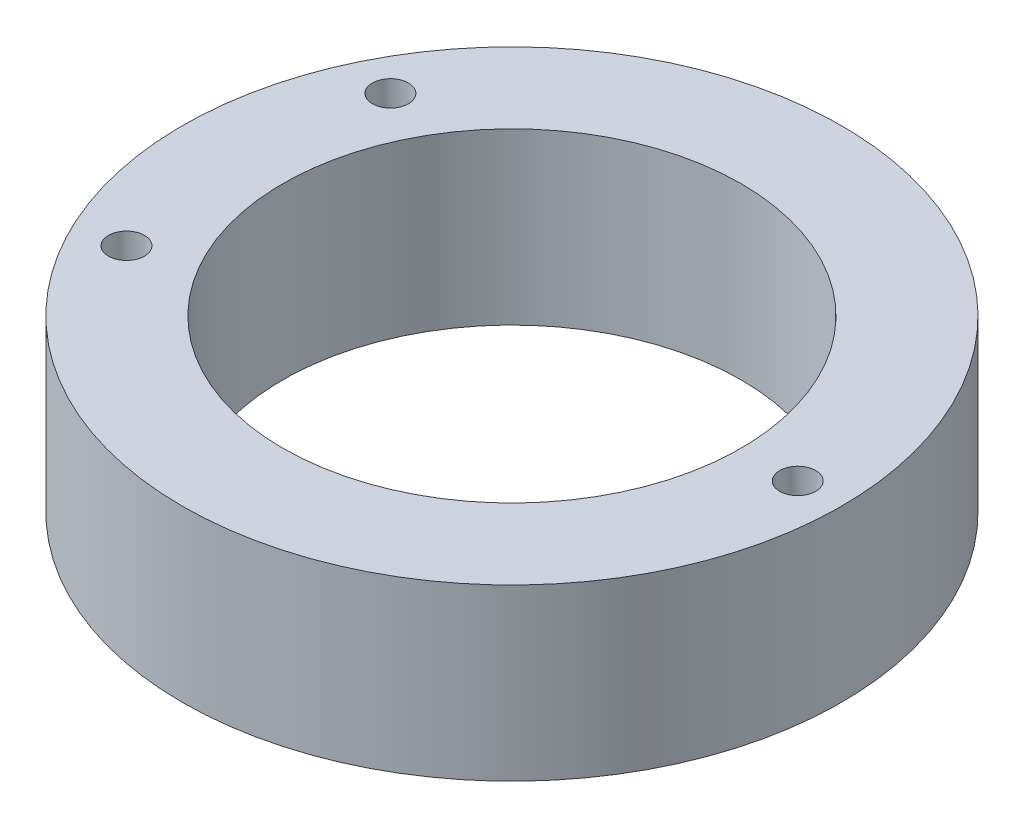
ISO-10303-21;
HEADER;
FILE_DESCRIPTION(('STEP AP214'),'2;1');
FILE_NAME('part.step','',(''),(''),'','','');
FILE_SCHEMA(('AUTOMOTIVE_DESIGN { 1 0 10303 214 1 1 1 1 }'));
ENDSEC;
DATA;
#1=APPLICATION_CONTEXT('core data for automotive mechanical design processes');
#2=APPLICATION_PROTOCOL_DEFINITION('international standard','automotive_design',2000,#1);
#3=PRODUCT_CONTEXT('',#1,'mechanical');
#4=PRODUCT('Part','Part','',(#3));
#5=PRODUCT_RELATED_PRODUCT_CATEGORY('part','',(#4));
#6=PRODUCT_DEFINITION_FORMATION('','',#4);
#7=PRODUCT_DEFINITION_CONTEXT('part definition',#1,'design');
#8=PRODUCT_DEFINITION('design','',#6,#7);
#9=PRODUCT_DEFINITION_SHAPE('','',#8);
#10=(LENGTH_UNIT() NAMED_UNIT(*) SI_UNIT(.MILLI.,.METRE.));
#11=(NAMED_UNIT(*) PLANE_ANGLE_UNIT() SI_UNIT($,.RADIAN.));
#12=(NAMED_UNIT(*) SI_UNIT($,.STERADIAN.) SOLID_ANGLE_UNIT());
#13=UNCERTAINTY_MEASURE_WITH_UNIT(LENGTH_MEASURE(1.E-05),#10,'distance_accuracy_value','');
#14=(GEOMETRIC_REPRESENTATION_CONTEXT(3) GLOBAL_UNCERTAINTY_ASSIGNED_CONTEXT((#13)) GLOBAL_UNIT_ASSIGNED_CONTEXT((#10,
#11,#12)) REPRESENTATION_CONTEXT('',''));
#15=CARTESIAN_POINT('',(0.,0.,0.));
#16=DIRECTION('',(0.,0.,1.));
#17=DIRECTION('',(1.,0.,0.));
#18=AXIS2_PLACEMENT_3D('',#15,#16,#17);
#19=CARTESIAN_POINT('',(0.,16.5,0.));
#20=DIRECTION('',(0.,1.,0.));
#21=DIRECTION('',(0.,0.,1.));
#22=AXIS2_PLACEMENT_3D('',#19,#20,#21);
#23=PLANE('',#22);
#24=CARTESIAN_POINT('',(-24.6145506206957,16.5,-12.8135240172721));
#25=DIRECTION('',(0.,1.,0.));
#26=DIRECTION('',(0.,0.,1.));
#27=AXIS2_PLACEMENT_3D('',#24,#25,#26);
#28=CIRCLE('',#27,1.75);
#29=CARTESIAN_POINT('',(-24.6145506206957,16.5,-11.0635240172721));
#30=VERTEX_POINT('',#29);
#31=EDGE_CURVE('E57',#30,#30,#28,.T.);
#32=ORIENTED_EDGE('',*,*,#31,.F.);
#33=EDGE_LOOP('',(#32));
#34=FACE_BOUND('',#33,.T.);
#35=CARTESIAN_POINT('',(0.,16.5,0.));
#36=DIRECTION('',(0.,1.,0.));
#37=DIRECTION('',(0.,0.,1.));
#38=AXIS2_PLACEMENT_3D('',#35,#36,#37);
#39=CIRCLE('',#38,22.25);
#40=CARTESIAN_POINT('',(0.,16.5,22.25));
#41=VERTEX_POINT('',#40);
#42=EDGE_CURVE('E46',#41,#41,#39,.T.);
#43=ORIENTED_EDGE('',*,*,#42,.F.);
#44=EDGE_LOOP('',(#43));
#45=FACE_BOUND('',#44,.T.);
#46=CARTESIAN_POINT('',(0.,16.5,0.));
#47=DIRECTION('',(0.,1.,0.));
#48=DIRECTION('',(0.,0.,1.));
#49=AXIS2_PLACEMENT_3D('',#46,#47,#48);
#50=CIRCLE('',#49,32.);
#51=CARTESIAN_POINT('',(0.,16.5,32.));
#52=VERTEX_POINT('',#51);
#53=EDGE_CURVE('E10',#52,#52,#50,.T.);
#54=ORIENTED_EDGE('',*,*,#53,.T.);
#55=EDGE_LOOP('',(#54));
#56=FACE_BOUND('',#55,.T.);
#57=CARTESIAN_POINT('',(27.75,16.5,0.));
#58=DIRECTION('',(0.,1.,0.));
#59=DIRECTION('',(0.,0.,1.));
#60=AXIS2_PLACEMENT_3D('',#57,#58,#59);
#61=CIRCLE('',#60,1.75);
#62=CARTESIAN_POINT('',(27.75,16.5,1.75));
#63=VERTEX_POINT('',#62);
#64=EDGE_CURVE('E51',#63,#63,#61,.T.);
#65=ORIENTED_EDGE('',*,*,#64,.F.);
#66=EDGE_LOOP('',(#65));
#67=FACE_BOUND('',#66,.T.);
#68=CARTESIAN_POINT('',(-24.6145506206957,16.5,12.8135240172721));
#69=DIRECTION('',(0.,1.,0.));
#70=DIRECTION('',(0.,0.,1.));
#71=AXIS2_PLACEMENT_3D('',#68,#69,#70);
#72=CIRCLE('',#71,1.75);
#73=CARTESIAN_POINT('',(-24.6145506206957,16.5,14.5635240172721));
#74=VERTEX_POINT('',#73);
#75=EDGE_CURVE('E63',#74,#74,#72,.T.);
#76=ORIENTED_EDGE('',*,*,#75,.F.);
#77=EDGE_LOOP('',(#76));
#78=FACE_BOUND('',#77,.T.);
#79=ADVANCED_FACE('F35',(#34,#45,#56,#67,#78),#23,.T.);
#80=CARTESIAN_POINT('',(0.,0.,0.));
#81=DIRECTION('',(0.,1.,0.));
#82=DIRECTION('',(0.,0.,1.));
#83=AXIS2_PLACEMENT_3D('',#80,#81,#82);
#84=PLANE('',#83);
#85=CARTESIAN_POINT('',(0.,0.,0.));
#86=DIRECTION('',(0.,1.,0.));
#87=DIRECTION('',(0.,0.,1.));
#88=AXIS2_PLACEMENT_3D('',#85,#86,#87);
#89=CIRCLE('',#88,32.);
#90=CARTESIAN_POINT('',(0.,0.,32.));
#91=VERTEX_POINT('',#90);
#92=EDGE_CURVE('E39',#91,#91,#89,.T.);
#93=ORIENTED_EDGE('',*,*,#92,.F.);
#94=EDGE_LOOP('',(#93));
#95=FACE_BOUND('',#94,.T.);
#96=CARTESIAN_POINT('',(0.,0.,0.));
#97=DIRECTION('',(0.,1.,0.));
#98=DIRECTION('',(0.,0.,1.));
#99=AXIS2_PLACEMENT_3D('',#96,#97,#98);
#100=CIRCLE('',#99,22.25);
#101=CARTESIAN_POINT('',(0.,0.,22.25));
#102=VERTEX_POINT('',#101);
#103=EDGE_CURVE('E48',#102,#102,#100,.T.);
#104=ORIENTED_EDGE('',*,*,#103,.T.);
#105=EDGE_LOOP('',(#104));
#106=FACE_BOUND('',#105,.T.);
#107=CARTESIAN_POINT('',(27.75,0.,0.));
#108=DIRECTION('',(0.,1.,0.));
#109=DIRECTION('',(0.,0.,1.));
#110=AXIS2_PLACEMENT_3D('',#107,#108,#109);
#111=CIRCLE('',#110,1.75);
#112=CARTESIAN_POINT('',(27.75,0.,1.75));
#113=VERTEX_POINT('',#112);
#114=EDGE_CURVE('E54',#113,#113,#111,.T.);
#115=ORIENTED_EDGE('',*,*,#114,.T.);
#116=EDGE_LOOP('',(#115));
#117=FACE_BOUND('',#116,.T.);
#118=CARTESIAN_POINT('',(-24.6145506206957,0.,-12.8135240172721));
#119=DIRECTION('',(0.,1.,0.));
#120=DIRECTION('',(0.,0.,1.));
#121=AXIS2_PLACEMENT_3D('',#118,#119,#120);
#122=CIRCLE('',#121,1.75);
#123=CARTESIAN_POINT('',(-24.6145506206957,0.,-11.0635240172721));
#124=VERTEX_POINT('',#123);
#125=EDGE_CURVE('E60',#124,#124,#122,.T.);
#126=ORIENTED_EDGE('',*,*,#125,.T.);
#127=EDGE_LOOP('',(#126));
#128=FACE_BOUND('',#127,.T.);
#129=CARTESIAN_POINT('',(-24.6145506206957,0.,12.8135240172721));
#130=DIRECTION('',(0.,1.,0.));
#131=DIRECTION('',(0.,0.,1.));
#132=AXIS2_PLACEMENT_3D('',#129,#130,#131);
#133=CIRCLE('',#132,1.75);
#134=CARTESIAN_POINT('',(-24.6145506206957,0.,14.5635240172721));
#135=VERTEX_POINT('',#134);
#136=EDGE_CURVE('E66',#135,#135,#133,.T.);
#137=ORIENTED_EDGE('',*,*,#136,.T.);
#138=EDGE_LOOP('',(#137));
#139=FACE_BOUND('',#138,.T.);
#140=ADVANCED_FACE('F76',(#95,#106,#117,#128,#139),#84,.F.);
#141=CARTESIAN_POINT('',(0.,16.5,0.));
#142=DIRECTION('',(0.,-1.,0.));
#143=DIRECTION('',(0.,0.,-1.));
#144=AXIS2_PLACEMENT_3D('',#141,#142,#143);
#145=CYLINDRICAL_SURFACE('',#144,32.);
#146=ORIENTED_EDGE('',*,*,#53,.F.);
#147=EDGE_LOOP('',(#146));
#148=FACE_BOUND('',#147,.T.);
#149=ORIENTED_EDGE('',*,*,#92,.T.);
#150=EDGE_LOOP('',(#149));
#151=FACE_BOUND('',#150,.T.);
#152=ADVANCED_FACE('F37',(#148,#151),#145,.T.);
#153=CARTESIAN_POINT('',(0.,16.5,0.));
#154=DIRECTION('',(0.,-1.,0.));
#155=DIRECTION('',(0.,0.,-1.));
#156=AXIS2_PLACEMENT_3D('',#153,#154,#155);
#157=CYLINDRICAL_SURFACE('',#156,22.25);
#158=ORIENTED_EDGE('',*,*,#42,.T.);
#159=EDGE_LOOP('',(#158));
#160=FACE_BOUND('',#159,.T.);
#161=ORIENTED_EDGE('',*,*,#103,.F.);
#162=EDGE_LOOP('',(#161));
#163=FACE_BOUND('',#162,.T.);
#164=ADVANCED_FACE('F86',(#160,#163),#157,.F.);
#165=CARTESIAN_POINT('',(27.75,16.5,0.));
#166=DIRECTION('',(0.,-1.,0.));
#167=DIRECTION('',(0.,0.,-1.));
#168=AXIS2_PLACEMENT_3D('',#165,#166,#167);
#169=CYLINDRICAL_SURFACE('',#168,1.75);
#170=ORIENTED_EDGE('',*,*,#64,.T.);
#171=EDGE_LOOP('',(#170));
#172=FACE_BOUND('',#171,.T.);
#173=ORIENTED_EDGE('',*,*,#114,.F.);
#174=EDGE_LOOP('',(#173));
#175=FACE_BOUND('',#174,.T.);
#176=ADVANCED_FACE('F89',(#172,#175),#169,.F.);
#177=CARTESIAN_POINT('',(-24.6145506206957,16.5,-12.8135240172721));
#178=DIRECTION('',(0.,-1.,0.));
#179=DIRECTION('',(0.,0.,-1.));
#180=AXIS2_PLACEMENT_3D('',#177,#178,#179);
#181=CYLINDRICAL_SURFACE('',#180,1.75);
#182=ORIENTED_EDGE('',*,*,#31,.T.);
#183=EDGE_LOOP('',(#182));
#184=FACE_BOUND('',#183,.T.);
#185=ORIENTED_EDGE('',*,*,#125,.F.);
#186=EDGE_LOOP('',(#185));
#187=FACE_BOUND('',#186,.T.);
#188=ADVANCED_FACE('F93',(#184,#187),#181,.F.);
#189=CARTESIAN_POINT('',(-24.6145506206957,16.5,12.8135240172721));
#190=DIRECTION('',(0.,-1.,0.));
#191=DIRECTION('',(0.,0.,-1.));
#192=AXIS2_PLACEMENT_3D('',#189,#190,#191);
#193=CYLINDRICAL_SURFACE('',#192,1.75);
#194=ORIENTED_EDGE('',*,*,#75,.T.);
#195=EDGE_LOOP('',(#194));
#196=FACE_BOUND('',#195,.T.);
#197=ORIENTED_EDGE('',*,*,#136,.F.);
#198=EDGE_LOOP('',(#197));
#199=FACE_BOUND('',#198,.T.);
#200=ADVANCED_FACE('F72',(#196,#199),#193,.F.);
#201=CLOSED_SHELL('',(#79,#140,#152,#164,#176,#188,#200));
#202=MANIFOLD_SOLID_BREP('B2',#201);
#203=ADVANCED_BREP_SHAPE_REPRESENTATION('',(#18,#202),#14);
#204=SHAPE_DEFINITION_REPRESENTATION(#9,#203);
ENDSEC;
END-ISO-10303-21;
